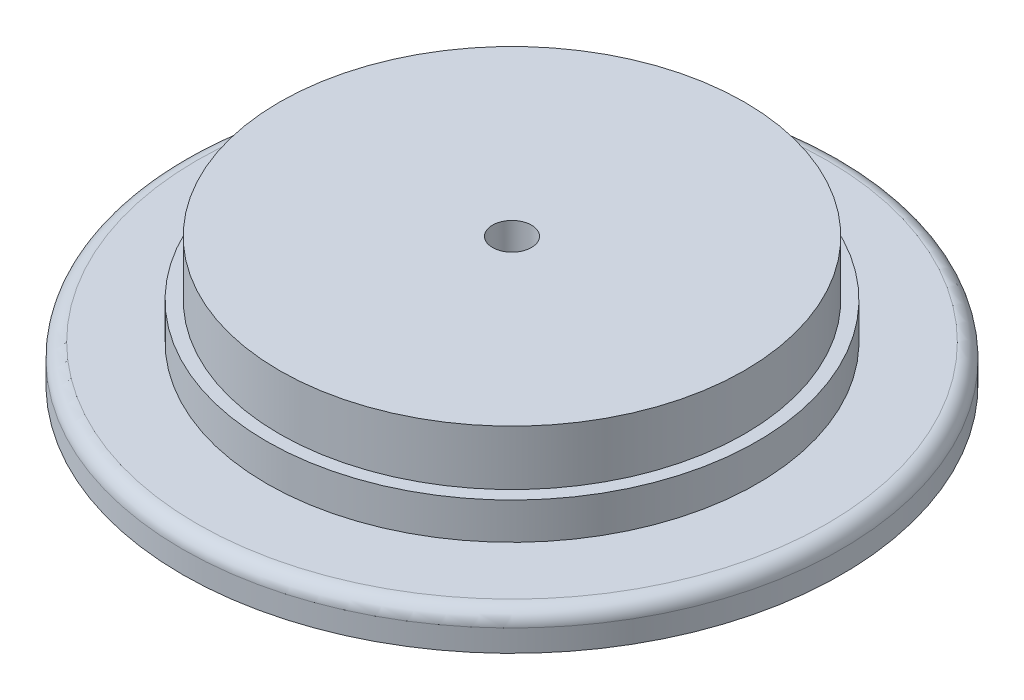
ISO-10303-21;
HEADER;
FILE_DESCRIPTION(('STEP AP214'),'2;1');
FILE_NAME('part.step','',(''),(''),'','','');
FILE_SCHEMA(('AUTOMOTIVE_DESIGN { 1 0 10303 214 1 1 1 1 }'));
ENDSEC;
DATA;
#1=APPLICATION_CONTEXT('core data for automotive mechanical design processes');
#2=APPLICATION_PROTOCOL_DEFINITION('international standard','automotive_design',2000,#1);
#3=PRODUCT_CONTEXT('',#1,'mechanical');
#4=PRODUCT('Part','Part','',(#3));
#5=PRODUCT_RELATED_PRODUCT_CATEGORY('part','',(#4));
#6=PRODUCT_DEFINITION_FORMATION('','',#4);
#7=PRODUCT_DEFINITION_CONTEXT('part definition',#1,'design');
#8=PRODUCT_DEFINITION('design','',#6,#7);
#9=PRODUCT_DEFINITION_SHAPE('','',#8);
#10=(LENGTH_UNIT() NAMED_UNIT(*) SI_UNIT(.MILLI.,.METRE.));
#11=(NAMED_UNIT(*) PLANE_ANGLE_UNIT() SI_UNIT($,.RADIAN.));
#12=(NAMED_UNIT(*) SI_UNIT($,.STERADIAN.) SOLID_ANGLE_UNIT());
#13=UNCERTAINTY_MEASURE_WITH_UNIT(LENGTH_MEASURE(1.E-05),#10,'distance_accuracy_value','');
#14=(GEOMETRIC_REPRESENTATION_CONTEXT(3) GLOBAL_UNCERTAINTY_ASSIGNED_CONTEXT((#13)) GLOBAL_UNIT_ASSIGNED_CONTEXT((#10,
#11,#12)) REPRESENTATION_CONTEXT('',''));
#15=CARTESIAN_POINT('',(0.,0.,0.));
#16=DIRECTION('',(0.,0.,1.));
#17=DIRECTION('',(1.,0.,0.));
#18=AXIS2_PLACEMENT_3D('',#15,#16,#17);
#19=CARTESIAN_POINT('',(0.,9.525,0.));
#20=DIRECTION('',(0.,-1.,0.));
#21=DIRECTION('',(0.,0.,-1.));
#22=AXIS2_PLACEMENT_3D('',#19,#20,#21);
#23=CYLINDRICAL_SURFACE('',#22,40.3225);
#24=CARTESIAN_POINT('',(0.,9.525,0.));
#25=DIRECTION('',(0.,1.,0.));
#26=DIRECTION('',(0.,0.,1.));
#27=AXIS2_PLACEMENT_3D('',#24,#25,#26);
#28=CIRCLE('',#27,40.3225);
#29=CARTESIAN_POINT('',(0.,9.525,-40.3225));
#30=VERTEX_POINT('',#29);
#31=EDGE_CURVE('E56',#30,#30,#28,.T.);
#32=CARTESIAN_POINT('',(0.,0.,0.));
#33=DIRECTION('',(0.,1.,0.));
#34=DIRECTION('',(0.,0.,1.));
#35=AXIS2_PLACEMENT_3D('',#32,#33,#34);
#36=CIRCLE('',#35,40.3225);
#37=CARTESIAN_POINT('',(0.,0.,-40.3225));
#38=VERTEX_POINT('',#37);
#39=EDGE_CURVE('E61',#38,#38,#36,.T.);
#40=CARTESIAN_POINT('',(0.,9.525,-40.3225));
#41=CARTESIAN_POINT('',(0.,9.42578125,-40.3225));
#42=CARTESIAN_POINT('',(0.,9.3265625,-40.3225));
#43=CARTESIAN_POINT('',(0.,9.128125,-40.3225));
#44=CARTESIAN_POINT('',(0.,9.02890625,-40.3225));
#45=CARTESIAN_POINT('',(0.,8.83046875,-40.3225));
#46=CARTESIAN_POINT('',(0.,8.73125,-40.3225));
#47=CARTESIAN_POINT('',(0.,8.5328125,-40.3225));
#48=CARTESIAN_POINT('',(0.,8.43359375,-40.3225));
#49=CARTESIAN_POINT('',(0.,8.23515625,-40.3225));
#50=CARTESIAN_POINT('',(0.,8.1359375,-40.3225));
#51=CARTESIAN_POINT('',(0.,7.9375,-40.3225));
#52=CARTESIAN_POINT('',(0.,7.83828125,-40.3225));
#53=CARTESIAN_POINT('',(0.,7.63984375,-40.3225));
#54=CARTESIAN_POINT('',(0.,7.540625,-40.3225));
#55=CARTESIAN_POINT('',(0.,7.3421875,-40.3225));
#56=CARTESIAN_POINT('',(0.,7.24296875,-40.3225));
#57=CARTESIAN_POINT('',(0.,7.04453125,-40.3225));
#58=CARTESIAN_POINT('',(0.,6.9453125,-40.3225));
#59=CARTESIAN_POINT('',(0.,6.746875,-40.3225));
#60=CARTESIAN_POINT('',(0.,6.64765625,-40.3225));
#61=CARTESIAN_POINT('',(0.,6.44921875,-40.3225));
#62=CARTESIAN_POINT('',(0.,6.35,-40.3225));
#63=CARTESIAN_POINT('',(0.,6.1515625,-40.3225));
#64=CARTESIAN_POINT('',(0.,6.05234375,-40.3225));
#65=CARTESIAN_POINT('',(0.,5.85390625,-40.3225));
#66=CARTESIAN_POINT('',(0.,5.7546875,-40.3225));
#67=CARTESIAN_POINT('',(0.,5.55625,-40.3225));
#68=CARTESIAN_POINT('',(0.,5.45703125,-40.3225));
#69=CARTESIAN_POINT('',(0.,5.25859375,-40.3225));
#70=CARTESIAN_POINT('',(0.,5.159375,-40.3225));
#71=CARTESIAN_POINT('',(0.,4.9609375,-40.3225));
#72=CARTESIAN_POINT('',(0.,4.86171875,-40.3225));
#73=CARTESIAN_POINT('',(0.,4.66328125,-40.3225));
#74=CARTESIAN_POINT('',(0.,4.5640625,-40.3225));
#75=CARTESIAN_POINT('',(0.,4.365625,-40.3225));
#76=CARTESIAN_POINT('',(0.,4.26640625,-40.3225));
#77=CARTESIAN_POINT('',(0.,4.06796875,-40.3225));
#78=CARTESIAN_POINT('',(0.,3.96875,-40.3225));
#79=CARTESIAN_POINT('',(0.,3.7703125,-40.3225));
#80=CARTESIAN_POINT('',(0.,3.67109375,-40.3225));
#81=CARTESIAN_POINT('',(0.,3.47265625,-40.3225));
#82=CARTESIAN_POINT('',(0.,3.3734375,-40.3225));
#83=CARTESIAN_POINT('',(0.,3.175,-40.3225));
#84=CARTESIAN_POINT('',(0.,3.07578125,-40.3225));
#85=CARTESIAN_POINT('',(0.,2.87734375,-40.3225));
#86=CARTESIAN_POINT('',(0.,2.778125,-40.3225));
#87=CARTESIAN_POINT('',(0.,2.5796875,-40.3225));
#88=CARTESIAN_POINT('',(0.,2.48046875,-40.3225));
#89=CARTESIAN_POINT('',(0.,2.28203125,-40.3225));
#90=CARTESIAN_POINT('',(0.,2.1828125,-40.3225));
#91=CARTESIAN_POINT('',(0.,1.984375,-40.3225));
#92=CARTESIAN_POINT('',(0.,1.88515625,-40.3225));
#93=CARTESIAN_POINT('',(0.,1.68671875,-40.3225));
#94=CARTESIAN_POINT('',(0.,1.5875,-40.3225));
#95=CARTESIAN_POINT('',(0.,1.3890625,-40.3225));
#96=CARTESIAN_POINT('',(0.,1.28984375,-40.3225));
#97=CARTESIAN_POINT('',(0.,1.09140625,-40.3225));
#98=CARTESIAN_POINT('',(0.,0.992187500000001,-40.3225));
#99=CARTESIAN_POINT('',(0.,0.793750000000001,-40.3225));
#100=CARTESIAN_POINT('',(0.,0.69453125,-40.3225));
#101=CARTESIAN_POINT('',(0.,0.49609375,-40.3225));
#102=CARTESIAN_POINT('',(0.,0.396875,-40.3225));
#103=CARTESIAN_POINT('',(0.,0.1984375,-40.3225));
#104=CARTESIAN_POINT('',(0.,0.0992187500000001,-40.3225));
#105=CARTESIAN_POINT('',(0.,0.,-40.3225));
#106=B_SPLINE_CURVE_WITH_KNOTS('',3,(#40,#41,#42,#43,#44,#45,#46,#47,#48,#49,#50,#51,#52,#53,
#54,#55,#56,#57,#58,#59,#60,#61,#62,#63,#64,#65,#66,#67,#68,#69,#70,#71,#72,#73,#74,#75,#76,#77,
#78,#79,#80,#81,#82,#83,#84,#85,#86,#87,#88,#89,#90,#91,#92,#93,#94,#95,#96,#97,#98,#99,#100,
#101,#102,#103,#104,#105),.UNSPECIFIED.,.F.,.F.,(4,2,2,2,2,2,2,2,2,2,2,2,2,2,2,2,2,2,2,2,2,2,2,
2,2,2,2,2,2,2,2,2,4),(0.,0.297656249999998,0.595312499999999,0.892968749999999,1.190625,
1.48828125,1.7859375,2.08359375,2.38125,2.67890625,2.9765625,3.27421875,3.571875,3.86953125,
4.1671875,4.46484375,4.7625,5.06015625,5.3578125,5.65546875,5.953125,6.25078125,6.5484375,
6.84609375,7.14375,7.44140625,7.7390625,8.03671875,8.334375,8.63203125,8.9296875,9.22734375,
9.525),.UNSPECIFIED.);
#107=EDGE_CURVE('BSEAM43',#30,#38,#106,.T.);
#108=ORIENTED_EDGE('',*,*,#31,.F.);
#109=ORIENTED_EDGE('',*,*,#39,.T.);
#110=ORIENTED_EDGE('',*,*,#107,.T.);
#111=ORIENTED_EDGE('',*,*,#107,.F.);
#112=EDGE_LOOP('',(#108,#110,#109,#111));
#113=FACE_BOUND('',#112,.T.);
#114=ADVANCED_FACE('F43',(#113),#23,.T.);
#115=CARTESIAN_POINT('',(0.,9.525,0.));
#116=DIRECTION('',(0.,1.,0.));
#117=DIRECTION('',(0.,0.,1.));
#118=AXIS2_PLACEMENT_3D('',#115,#116,#117);
#119=PLANE('',#118);
#120=CARTESIAN_POINT('',(0.,9.525,0.));
#121=DIRECTION('',(0.,1.,0.));
#122=DIRECTION('',(0.,0.,1.));
#123=AXIS2_PLACEMENT_3D('',#120,#121,#122);
#124=CIRCLE('',#123,3.3782);
#125=CARTESIAN_POINT('',(0.,9.525,3.3782));
#126=VERTEX_POINT('',#125);
#127=EDGE_CURVE('E79',#126,#126,#124,.T.);
#128=ORIENTED_EDGE('',*,*,#127,.F.);
#129=EDGE_LOOP('',(#128));
#130=FACE_BOUND('',#129,.T.);
#131=ORIENTED_EDGE('',*,*,#31,.T.);
#132=EDGE_LOOP('',(#131));
#133=FACE_BOUND('',#132,.T.);
#134=ADVANCED_FACE('F113',(#130,#133),#119,.T.);
#135=CARTESIAN_POINT('',(0.,-6.35,0.));
#136=DIRECTION('',(0.,1.,0.));
#137=DIRECTION('',(0.,0.,1.));
#138=AXIS2_PLACEMENT_3D('',#135,#136,#137);
#139=CYLINDRICAL_SURFACE('',#138,42.545);
#140=CARTESIAN_POINT('',(0.,-6.35,0.));
#141=DIRECTION('',(0.,-1.,0.));
#142=DIRECTION('',(0.,0.,-1.));
#143=AXIS2_PLACEMENT_3D('',#140,#141,#142);
#144=CIRCLE('',#143,42.545);
#145=CARTESIAN_POINT('',(0.,-6.35,-42.545));
#146=VERTEX_POINT('',#145);
#147=EDGE_CURVE('E66',#146,#146,#144,.T.);
#148=ORIENTED_EDGE('',*,*,#147,.F.);
#149=EDGE_LOOP('',(#148));
#150=FACE_BOUND('',#149,.T.);
#151=CARTESIAN_POINT('',(0.,0.,0.));
#152=DIRECTION('',(0.,-1.,0.));
#153=DIRECTION('',(0.,0.,-1.));
#154=AXIS2_PLACEMENT_3D('',#151,#152,#153);
#155=CIRCLE('',#154,42.545);
#156=CARTESIAN_POINT('',(0.,0.,-42.545));
#157=VERTEX_POINT('',#156);
#158=EDGE_CURVE('E68',#157,#157,#155,.T.);
#159=ORIENTED_EDGE('',*,*,#158,.T.);
#160=EDGE_LOOP('',(#159));
#161=FACE_BOUND('',#160,.T.);
#162=ADVANCED_FACE('F108',(#150,#161),#139,.T.);
#163=CARTESIAN_POINT('',(0.,0.,0.));
#164=DIRECTION('',(0.,-1.,0.));
#165=DIRECTION('',(0.,0.,-1.));
#166=AXIS2_PLACEMENT_3D('',#163,#164,#165);
#167=PLANE('',#166);
#168=ORIENTED_EDGE('',*,*,#39,.F.);
#169=EDGE_LOOP('',(#168));
#170=FACE_BOUND('',#169,.T.);
#171=ORIENTED_EDGE('',*,*,#158,.F.);
#172=EDGE_LOOP('',(#171));
#173=FACE_BOUND('',#172,.T.);
#174=ADVANCED_FACE('F103',(#170,#173),#167,.F.);
#175=CARTESIAN_POINT('',(0.,-12.7,0.));
#176=DIRECTION('',(0.,1.,0.));
#177=DIRECTION('',(0.,0.,1.));
#178=AXIS2_PLACEMENT_3D('',#175,#176,#177);
#179=CYLINDRICAL_SURFACE('',#178,57.15);
#180=CARTESIAN_POINT('',(0.,-8.89,0.));
#181=DIRECTION('',(0.,-1.,0.));
#182=DIRECTION('',(0.,0.,-1.));
#183=AXIS2_PLACEMENT_3D('',#180,#181,#182);
#184=CIRCLE('',#183,57.15);
#185=CARTESIAN_POINT('',(0.,-8.89,-57.15));
#186=VERTEX_POINT('',#185);
#187=EDGE_CURVE('E51',#186,#186,#184,.T.);
#188=ORIENTED_EDGE('',*,*,#187,.T.);
#189=EDGE_LOOP('',(#188));
#190=FACE_BOUND('',#189,.T.);
#191=CARTESIAN_POINT('',(0.,-12.7,0.));
#192=DIRECTION('',(0.,-1.,0.));
#193=DIRECTION('',(0.,0.,-1.));
#194=AXIS2_PLACEMENT_3D('',#191,#192,#193);
#195=CIRCLE('',#194,57.15);
#196=CARTESIAN_POINT('',(0.,-12.7,-57.15));
#197=VERTEX_POINT('',#196);
#198=EDGE_CURVE('E72',#197,#197,#195,.T.);
#199=ORIENTED_EDGE('',*,*,#198,.F.);
#200=EDGE_LOOP('',(#199));
#201=FACE_BOUND('',#200,.T.);
#202=ADVANCED_FACE('F98',(#190,#201),#179,.T.);
#203=CARTESIAN_POINT('',(0.,-12.7,0.));
#204=DIRECTION('',(0.,-1.,0.));
#205=DIRECTION('',(0.,0.,-1.));
#206=AXIS2_PLACEMENT_3D('',#203,#204,#205);
#207=PLANE('',#206);
#208=CARTESIAN_POINT('',(0.,-12.7,0.));
#209=DIRECTION('',(0.,-1.,0.));
#210=DIRECTION('',(0.,0.,-1.));
#211=AXIS2_PLACEMENT_3D('',#208,#209,#210);
#212=CIRCLE('',#211,6.4389);
#213=CARTESIAN_POINT('',(0.,-12.7,-6.4389));
#214=VERTEX_POINT('',#213);
#215=EDGE_CURVE('E87',#214,#214,#212,.T.);
#216=ORIENTED_EDGE('',*,*,#215,.F.);
#217=EDGE_LOOP('',(#216));
#218=FACE_BOUND('',#217,.T.);
#219=ORIENTED_EDGE('',*,*,#198,.T.);
#220=EDGE_LOOP('',(#219));
#221=FACE_BOUND('',#220,.T.);
#222=ADVANCED_FACE('F94',(#218,#221),#207,.T.);
#223=CARTESIAN_POINT('',(0.,-6.35,0.));
#224=DIRECTION('',(0.,-1.,0.));
#225=DIRECTION('',(0.,0.,-1.));
#226=AXIS2_PLACEMENT_3D('',#223,#224,#225);
#227=PLANE('',#226);
#228=CARTESIAN_POINT('',(0.,-6.35,0.));
#229=DIRECTION('',(0.,-1.,0.));
#230=DIRECTION('',(0.,0.,-1.));
#231=AXIS2_PLACEMENT_3D('',#228,#229,#230);
#232=CIRCLE('',#231,54.61);
#233=CARTESIAN_POINT('',(0.,-6.35,-54.61));
#234=VERTEX_POINT('',#233);
#235=EDGE_CURVE('E10',#234,#234,#232,.F.);
#236=ORIENTED_EDGE('',*,*,#235,.T.);
#237=EDGE_LOOP('',(#236));
#238=FACE_BOUND('',#237,.T.);
#239=ORIENTED_EDGE('',*,*,#147,.T.);
#240=EDGE_LOOP('',(#239));
#241=FACE_BOUND('',#240,.T.);
#242=ADVANCED_FACE('F97',(#238,#241),#227,.F.);
#243=CARTESIAN_POINT('',(0.,-8.89,0.));
#244=DIRECTION('',(0.,-1.,0.));
#245=DIRECTION('',(0.,0.,-1.));
#246=AXIS2_PLACEMENT_3D('',#243,#244,#245);
#247=TOROIDAL_SURFACE('',#246,54.61,2.54);
#248=ORIENTED_EDGE('',*,*,#235,.F.);
#249=EDGE_LOOP('',(#248));
#250=FACE_BOUND('',#249,.T.);
#251=ORIENTED_EDGE('',*,*,#187,.F.);
#252=EDGE_LOOP('',(#251));
#253=FACE_BOUND('',#252,.T.);
#254=ADVANCED_FACE('F45',(#250,#253),#247,.T.);
#255=CARTESIAN_POINT('',(0.,-12.7,0.));
#256=DIRECTION('',(0.,-1.,0.));
#257=DIRECTION('',(0.,0.,-1.));
#258=AXIS2_PLACEMENT_3D('',#255,#256,#257);
#259=CYLINDRICAL_SURFACE('',#258,3.3782);
#260=CARTESIAN_POINT('',(0.,-10.1317677588557,0.));
#261=DIRECTION('',(0.,-1.,0.));
#262=DIRECTION('',(0.,0.,-1.));
#263=AXIS2_PLACEMENT_3D('',#260,#261,#262);
#264=CIRCLE('',#263,3.3782);
#265=CARTESIAN_POINT('',(0.,-10.1317677588557,-3.3782));
#266=VERTEX_POINT('',#265);
#267=EDGE_CURVE('E83',#266,#266,#264,.T.);
#268=ORIENTED_EDGE('',*,*,#267,.T.);
#269=EDGE_LOOP('',(#268));
#270=FACE_BOUND('',#269,.T.);
#271=ORIENTED_EDGE('',*,*,#127,.T.);
#272=EDGE_LOOP('',(#271));
#273=FACE_BOUND('',#272,.T.);
#274=ADVANCED_FACE('F136',(#270,#273),#259,.F.);
#275=CARTESIAN_POINT('',(0.,-12.7,0.));
#276=DIRECTION('',(0.,-1.,0.));
#277=DIRECTION('',(0.,0.,-1.));
#278=AXIS2_PLACEMENT_3D('',#275,#276,#277);
#279=CONICAL_SURFACE('',#278,6.4389,0.872664625997164);
#280=ORIENTED_EDGE('',*,*,#267,.F.);
#281=EDGE_LOOP('',(#280));
#282=FACE_BOUND('',#281,.T.);
#283=ORIENTED_EDGE('',*,*,#215,.T.);
#284=EDGE_LOOP('',(#283));
#285=FACE_BOUND('',#284,.T.);
#286=ADVANCED_FACE('F92',(#282,#285),#279,.F.);
#287=CLOSED_SHELL('',(#114,#134,#162,#174,#202,#222,#242,#254,#274,#286));
#288=MANIFOLD_SOLID_BREP('B2',#287);
#289=ADVANCED_BREP_SHAPE_REPRESENTATION('',(#18,#288),#14);
#290=SHAPE_DEFINITION_REPRESENTATION(#9,#289);
ENDSEC;
END-ISO-10303-21;
